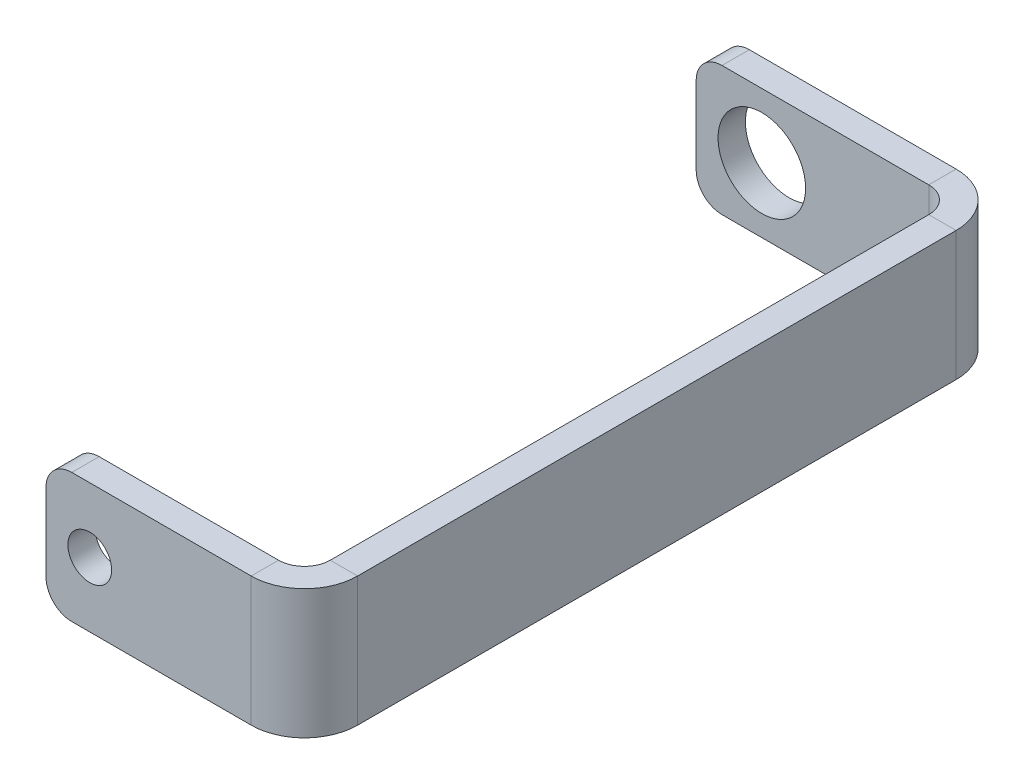
ISO-10303-21;
HEADER;
FILE_DESCRIPTION(('STEP AP214'),'2;1');
FILE_NAME('part.step','',(''),(''),'','','');
FILE_SCHEMA(('AUTOMOTIVE_DESIGN { 1 0 10303 214 1 1 1 1 }'));
ENDSEC;
DATA;
#1=APPLICATION_CONTEXT('core data for automotive mechanical design processes');
#2=APPLICATION_PROTOCOL_DEFINITION('international standard','automotive_design',2000,#1);
#3=PRODUCT_CONTEXT('',#1,'mechanical');
#4=PRODUCT('Part','Part','',(#3));
#5=PRODUCT_RELATED_PRODUCT_CATEGORY('part','',(#4));
#6=PRODUCT_DEFINITION_FORMATION('','',#4);
#7=PRODUCT_DEFINITION_CONTEXT('part definition',#1,'design');
#8=PRODUCT_DEFINITION('design','',#6,#7);
#9=PRODUCT_DEFINITION_SHAPE('','',#8);
#10=(LENGTH_UNIT() NAMED_UNIT(*) SI_UNIT(.MILLI.,.METRE.));
#11=(NAMED_UNIT(*) PLANE_ANGLE_UNIT() SI_UNIT($,.RADIAN.));
#12=(NAMED_UNIT(*) SI_UNIT($,.STERADIAN.) SOLID_ANGLE_UNIT());
#13=UNCERTAINTY_MEASURE_WITH_UNIT(LENGTH_MEASURE(1.E-05),#10,'distance_accuracy_value','');
#14=(GEOMETRIC_REPRESENTATION_CONTEXT(3) GLOBAL_UNCERTAINTY_ASSIGNED_CONTEXT((#13)) GLOBAL_UNIT_ASSIGNED_CONTEXT((#10,
#11,#12)) REPRESENTATION_CONTEXT('',''));
#15=CARTESIAN_POINT('',(0.,0.,0.));
#16=DIRECTION('',(0.,0.,1.));
#17=DIRECTION('',(1.,0.,0.));
#18=AXIS2_PLACEMENT_3D('',#15,#16,#17);
#19=CARTESIAN_POINT('',(18.175,7.5,0.));
#20=DIRECTION('',(0.,1.,0.));
#21=DIRECTION('',(0.,0.,1.));
#22=AXIS2_PLACEMENT_3D('',#19,#20,#21);
#23=PLANE('',#22);
#24=DIRECTION('',(0.,0.,-1.));
#25=VECTOR('',#24,1.);
#26=CARTESIAN_POINT('',(15.,7.5,0.));
#27=LINE('',#26,#25);
#28=CARTESIAN_POINT('',(15.0000000000003,7.5,72.477));
#29=VERTEX_POINT('',#28);
#30=CARTESIAN_POINT('',(15.,7.5,2.99999999999999));
#31=VERTEX_POINT('',#30);
#32=EDGE_CURVE('E236',#29,#31,#27,.T.);
#33=ORIENTED_EDGE('',*,*,#32,.F.);
#34=DIRECTION('',(1.,0.,0.));
#35=VECTOR('',#34,1.);
#36=CARTESIAN_POINT('',(15.0000000000003,7.5,72.477));
#37=LINE('',#36,#35);
#38=CARTESIAN_POINT('',(18.1750000000003,7.5,72.477));
#39=VERTEX_POINT('',#38);
#40=EDGE_CURVE('E208',#29,#39,#37,.T.);
#41=ORIENTED_EDGE('',*,*,#40,.T.);
#42=DIRECTION('',(0.,0.,-1.));
#43=VECTOR('',#42,1.);
#44=CARTESIAN_POINT('',(18.175,7.5,0.));
#45=LINE('',#44,#43);
#46=CARTESIAN_POINT('',(18.175,7.5,2.99999999999998));
#47=VERTEX_POINT('',#46);
#48=EDGE_CURVE('E235',#39,#47,#45,.T.);
#49=ORIENTED_EDGE('',*,*,#48,.T.);
#50=DIRECTION('',(1.,0.,0.));
#51=VECTOR('',#50,1.);
#52=CARTESIAN_POINT('',(15.,7.5,2.99999999999999));
#53=LINE('',#52,#51);
#54=EDGE_CURVE('E223',#31,#47,#53,.T.);
#55=ORIENTED_EDGE('',*,*,#54,.F.);
#56=EDGE_LOOP('',(#33,#41,#49,#55));
#57=FACE_BOUND('',#56,.T.);
#58=ADVANCED_FACE('F43',(#57),#23,.T.);
#59=CARTESIAN_POINT('',(18.175,0.,0.));
#60=DIRECTION('',(1.,0.,0.));
#61=DIRECTION('',(0.,0.,-1.));
#62=AXIS2_PLACEMENT_3D('',#59,#60,#61);
#63=PLANE('',#62);
#64=ORIENTED_EDGE('',*,*,#48,.F.);
#65=DIRECTION('',(0.,1.,0.));
#66=VECTOR('',#65,1.);
#67=CARTESIAN_POINT('',(18.1750000000003,7.5,72.477));
#68=LINE('',#67,#66);
#69=CARTESIAN_POINT('',(18.1750000000003,-7.5,72.477));
#70=VERTEX_POINT('',#69);
#71=EDGE_CURVE('E177',#39,#70,#68,.F.);
#72=ORIENTED_EDGE('',*,*,#71,.T.);
#73=DIRECTION('',(0.,0.,1.));
#74=VECTOR('',#73,1.);
#75=CARTESIAN_POINT('',(18.1750000000003,-7.5,75.477));
#76=LINE('',#75,#74);
#77=CARTESIAN_POINT('',(18.175,-7.5,2.99999999999998));
#78=VERTEX_POINT('',#77);
#79=EDGE_CURVE('E232',#78,#70,#76,.T.);
#80=ORIENTED_EDGE('',*,*,#79,.F.);
#81=DIRECTION('',(0.,1.,0.));
#82=VECTOR('',#81,1.);
#83=CARTESIAN_POINT('',(18.175,0.,2.99999999999998));
#84=LINE('',#83,#82);
#85=EDGE_CURVE('E226',#78,#47,#84,.T.);
#86=ORIENTED_EDGE('',*,*,#85,.T.);
#87=EDGE_LOOP('',(#64,#72,#80,#86));
#88=FACE_BOUND('',#87,.T.);
#89=ADVANCED_FACE('F350',(#88),#63,.T.);
#90=CARTESIAN_POINT('',(15.,0.,0.));
#91=DIRECTION('',(1.,0.,0.));
#92=DIRECTION('',(0.,0.,-1.));
#93=AXIS2_PLACEMENT_3D('',#90,#91,#92);
#94=PLANE('',#93);
#95=DIRECTION('',(0.,1.,0.));
#96=VECTOR('',#95,1.);
#97=CARTESIAN_POINT('',(15.0000000000003,7.5,72.477));
#98=LINE('',#97,#96);
#99=CARTESIAN_POINT('',(15.0000000000003,-7.5,72.477));
#100=VERTEX_POINT('',#99);
#101=EDGE_CURVE('E212',#29,#100,#98,.F.);
#102=ORIENTED_EDGE('',*,*,#101,.F.);
#103=ORIENTED_EDGE('',*,*,#32,.T.);
#104=DIRECTION('',(0.,1.,0.));
#105=VECTOR('',#104,1.);
#106=CARTESIAN_POINT('',(15.,-7.5,2.99999999999999));
#107=LINE('',#106,#105);
#108=CARTESIAN_POINT('',(15.,-7.5,2.99999999999999));
#109=VERTEX_POINT('',#108);
#110=EDGE_CURVE('E220',#109,#31,#107,.T.);
#111=ORIENTED_EDGE('',*,*,#110,.F.);
#112=DIRECTION('',(0.,0.,1.));
#113=VECTOR('',#112,1.);
#114=CARTESIAN_POINT('',(15.0000000000003,-7.5,75.477));
#115=LINE('',#114,#113);
#116=EDGE_CURVE('E231',#109,#100,#115,.T.);
#117=ORIENTED_EDGE('',*,*,#116,.T.);
#118=EDGE_LOOP('',(#102,#103,#111,#117));
#119=FACE_BOUND('',#118,.T.);
#120=ADVANCED_FACE('F360',(#119),#94,.F.);
#121=CARTESIAN_POINT('',(-15.,7.5,-3.175));
#122=DIRECTION('',(0.,1.,0.));
#123=DIRECTION('',(0.,0.,1.));
#124=AXIS2_PLACEMENT_3D('',#121,#122,#123);
#125=PLANE('',#124);
#126=DIRECTION('',(-1.,0.,0.));
#127=VECTOR('',#126,1.);
#128=CARTESIAN_POINT('',(-15.,7.5,-3.175));
#129=LINE('',#128,#127);
#130=CARTESIAN_POINT('',(12.,7.5,-3.175));
#131=VERTEX_POINT('',#130);
#132=CARTESIAN_POINT('',(-12.,7.5,-3.175));
#133=VERTEX_POINT('',#132);
#134=EDGE_CURVE('E266',#131,#133,#129,.T.);
#135=ORIENTED_EDGE('',*,*,#134,.T.);
#136=DIRECTION('',(0.,0.,1.));
#137=VECTOR('',#136,1.);
#138=CARTESIAN_POINT('',(-12.,7.5,-3.175));
#139=LINE('',#138,#137);
#140=CARTESIAN_POINT('',(-12.,7.5,0.));
#141=VERTEX_POINT('',#140);
#142=EDGE_CURVE('E302',#133,#141,#139,.T.);
#143=ORIENTED_EDGE('',*,*,#142,.T.);
#144=DIRECTION('',(-1.,0.,0.));
#145=VECTOR('',#144,1.);
#146=CARTESIAN_POINT('',(-15.,7.5,0.));
#147=LINE('',#146,#145);
#148=CARTESIAN_POINT('',(12.,7.5,0.));
#149=VERTEX_POINT('',#148);
#150=EDGE_CURVE('E263',#149,#141,#147,.T.);
#151=ORIENTED_EDGE('',*,*,#150,.F.);
#152=DIRECTION('',(0.,0.,-1.));
#153=VECTOR('',#152,1.);
#154=CARTESIAN_POINT('',(12.,7.5,0.));
#155=LINE('',#154,#153);
#156=EDGE_CURVE('E249',#149,#131,#155,.T.);
#157=ORIENTED_EDGE('',*,*,#156,.T.);
#158=EDGE_LOOP('',(#135,#143,#151,#157));
#159=FACE_BOUND('',#158,.T.);
#160=ADVANCED_FACE('F321',(#159),#125,.T.);
#161=CARTESIAN_POINT('',(0.,0.,-3.175));
#162=DIRECTION('',(0.,0.,-1.));
#163=DIRECTION('',(-1.,0.,0.));
#164=AXIS2_PLACEMENT_3D('',#161,#162,#163);
#165=PLANE('',#164);
#166=CARTESIAN_POINT('',(-7.38,0.,-3.175));
#167=DIRECTION('',(0.,0.,1.));
#168=DIRECTION('',(1.,0.,0.));
#169=AXIS2_PLACEMENT_3D('',#166,#167,#168);
#170=CIRCLE('',#169,5.08);
#171=CARTESIAN_POINT('',(-2.3,0.,-3.175));
#172=VERTEX_POINT('',#171);
#173=EDGE_CURVE('E370',#172,#172,#170,.T.);
#174=ORIENTED_EDGE('',*,*,#173,.T.);
#175=EDGE_LOOP('',(#174));
#176=FACE_BOUND('',#175,.T.);
#177=DIRECTION('',(0.,-1.,0.));
#178=VECTOR('',#177,1.);
#179=CARTESIAN_POINT('',(-15.,-7.5,-3.175));
#180=LINE('',#179,#178);
#181=CARTESIAN_POINT('',(-15.,4.5,-3.175));
#182=VERTEX_POINT('',#181);
#183=CARTESIAN_POINT('',(-15.,-4.5,-3.175));
#184=VERTEX_POINT('',#183);
#185=EDGE_CURVE('E269',#182,#184,#180,.T.);
#186=ORIENTED_EDGE('',*,*,#185,.F.);
#187=CARTESIAN_POINT('',(-12.,4.5,-3.175));
#188=DIRECTION('',(0.,0.,-1.));
#189=DIRECTION('',(-1.,0.,0.));
#190=AXIS2_PLACEMENT_3D('',#187,#188,#189);
#191=CIRCLE('',#190,3.);
#192=EDGE_CURVE('E51',#182,#133,#191,.T.);
#193=ORIENTED_EDGE('',*,*,#192,.T.);
#194=ORIENTED_EDGE('',*,*,#134,.F.);
#195=DIRECTION('',(0.,1.,0.));
#196=VECTOR('',#195,1.);
#197=CARTESIAN_POINT('',(12.,7.5,-3.175));
#198=LINE('',#197,#196);
#199=CARTESIAN_POINT('',(12.,-7.5,-3.175));
#200=VERTEX_POINT('',#199);
#201=EDGE_CURVE('E242',#131,#200,#198,.F.);
#202=ORIENTED_EDGE('',*,*,#201,.T.);
#203=DIRECTION('',(1.,0.,0.));
#204=VECTOR('',#203,1.);
#205=CARTESIAN_POINT('',(-15.,-7.5,-3.175));
#206=LINE('',#205,#204);
#207=CARTESIAN_POINT('',(-12.,-7.5,-3.175));
#208=VERTEX_POINT('',#207);
#209=EDGE_CURVE('E272',#208,#200,#206,.T.);
#210=ORIENTED_EDGE('',*,*,#209,.F.);
#211=CARTESIAN_POINT('',(-12.,-4.5,-3.175));
#212=DIRECTION('',(0.,0.,-1.));
#213=DIRECTION('',(-1.,0.,0.));
#214=AXIS2_PLACEMENT_3D('',#211,#212,#213);
#215=CIRCLE('',#214,3.);
#216=EDGE_CURVE('E63',#208,#184,#215,.T.);
#217=ORIENTED_EDGE('',*,*,#216,.T.);
#218=EDGE_LOOP('',(#186,#193,#194,#202,#210,#217));
#219=FACE_BOUND('',#218,.T.);
#220=ADVANCED_FACE('F316',(#176,#219),#165,.T.);
#221=CARTESIAN_POINT('',(0.,0.,0.));
#222=DIRECTION('',(0.,0.,-1.));
#223=DIRECTION('',(-1.,0.,0.));
#224=AXIS2_PLACEMENT_3D('',#221,#222,#223);
#225=PLANE('',#224);
#226=CARTESIAN_POINT('',(-7.38,0.,0.));
#227=DIRECTION('',(0.,0.,1.));
#228=DIRECTION('',(1.,0.,0.));
#229=AXIS2_PLACEMENT_3D('',#226,#227,#228);
#230=CIRCLE('',#229,5.08);
#231=CARTESIAN_POINT('',(-2.3,0.,0.));
#232=VERTEX_POINT('',#231);
#233=EDGE_CURVE('E284',#232,#232,#230,.T.);
#234=ORIENTED_EDGE('',*,*,#233,.F.);
#235=EDGE_LOOP('',(#234));
#236=FACE_BOUND('',#235,.T.);
#237=ORIENTED_EDGE('',*,*,#150,.T.);
#238=CARTESIAN_POINT('',(-12.,4.5,0.));
#239=DIRECTION('',(0.,0.,-1.));
#240=DIRECTION('',(-1.,0.,0.));
#241=AXIS2_PLACEMENT_3D('',#238,#239,#240);
#242=CIRCLE('',#241,3.);
#243=CARTESIAN_POINT('',(-15.,4.5,0.));
#244=VERTEX_POINT('',#243);
#245=EDGE_CURVE('E307',#141,#244,#242,.F.);
#246=ORIENTED_EDGE('',*,*,#245,.T.);
#247=DIRECTION('',(0.,-1.,0.));
#248=VECTOR('',#247,1.);
#249=CARTESIAN_POINT('',(-15.,-7.5,0.));
#250=LINE('',#249,#248);
#251=CARTESIAN_POINT('',(-15.,-4.5,0.));
#252=VERTEX_POINT('',#251);
#253=EDGE_CURVE('E277',#244,#252,#250,.T.);
#254=ORIENTED_EDGE('',*,*,#253,.T.);
#255=CARTESIAN_POINT('',(-12.,-4.5,0.));
#256=DIRECTION('',(0.,0.,-1.));
#257=DIRECTION('',(-1.,0.,0.));
#258=AXIS2_PLACEMENT_3D('',#255,#256,#257);
#259=CIRCLE('',#258,3.);
#260=CARTESIAN_POINT('',(-12.,-7.5,0.));
#261=VERTEX_POINT('',#260);
#262=EDGE_CURVE('E305',#252,#261,#259,.F.);
#263=ORIENTED_EDGE('',*,*,#262,.T.);
#264=DIRECTION('',(1.,0.,0.));
#265=VECTOR('',#264,1.);
#266=CARTESIAN_POINT('',(-15.,-7.5,0.));
#267=LINE('',#266,#265);
#268=CARTESIAN_POINT('',(12.,-7.5,0.));
#269=VERTEX_POINT('',#268);
#270=EDGE_CURVE('E270',#261,#269,#267,.T.);
#271=ORIENTED_EDGE('',*,*,#270,.T.);
#272=DIRECTION('',(0.,1.,0.));
#273=VECTOR('',#272,1.);
#274=CARTESIAN_POINT('',(12.,7.5,0.));
#275=LINE('',#274,#273);
#276=EDGE_CURVE('E255',#149,#269,#275,.F.);
#277=ORIENTED_EDGE('',*,*,#276,.F.);
#278=EDGE_LOOP('',(#237,#246,#254,#263,#271,#277));
#279=FACE_BOUND('',#278,.T.);
#280=ADVANCED_FACE('F326',(#236,#279),#225,.F.);
#281=CARTESIAN_POINT('',(-15.,-7.5,-3.175));
#282=DIRECTION('',(0.,-1.,0.));
#283=DIRECTION('',(0.,0.,-1.));
#284=AXIS2_PLACEMENT_3D('',#281,#282,#283);
#285=PLANE('',#284);
#286=ORIENTED_EDGE('',*,*,#270,.F.);
#287=DIRECTION('',(0.,0.,1.));
#288=VECTOR('',#287,1.);
#289=CARTESIAN_POINT('',(-12.,-7.5,-3.175));
#290=LINE('',#289,#288);
#291=EDGE_CURVE('E11',#261,#208,#290,.F.);
#292=ORIENTED_EDGE('',*,*,#291,.T.);
#293=ORIENTED_EDGE('',*,*,#209,.T.);
#294=DIRECTION('',(0.,0.,-1.));
#295=VECTOR('',#294,1.);
#296=CARTESIAN_POINT('',(12.,-7.5,0.));
#297=LINE('',#296,#295);
#298=EDGE_CURVE('E260',#269,#200,#297,.T.);
#299=ORIENTED_EDGE('',*,*,#298,.F.);
#300=EDGE_LOOP('',(#286,#292,#293,#299));
#301=FACE_BOUND('',#300,.T.);
#302=ADVANCED_FACE('F333',(#301),#285,.T.);
#303=CARTESIAN_POINT('',(-15.,-7.5,-3.175));
#304=DIRECTION('',(-1.,0.,0.));
#305=DIRECTION('',(0.,0.,1.));
#306=AXIS2_PLACEMENT_3D('',#303,#304,#305);
#307=PLANE('',#306);
#308=ORIENTED_EDGE('',*,*,#253,.F.);
#309=DIRECTION('',(0.,0.,1.));
#310=VECTOR('',#309,1.);
#311=CARTESIAN_POINT('',(-15.,4.5,-3.175));
#312=LINE('',#311,#310);
#313=EDGE_CURVE('E312',#244,#182,#312,.F.);
#314=ORIENTED_EDGE('',*,*,#313,.T.);
#315=ORIENTED_EDGE('',*,*,#185,.T.);
#316=DIRECTION('',(0.,0.,1.));
#317=VECTOR('',#316,1.);
#318=CARTESIAN_POINT('',(-15.,-4.5,-3.175));
#319=LINE('',#318,#317);
#320=EDGE_CURVE('E309',#184,#252,#319,.T.);
#321=ORIENTED_EDGE('',*,*,#320,.T.);
#322=EDGE_LOOP('',(#308,#314,#315,#321));
#323=FACE_BOUND('',#322,.T.);
#324=ADVANCED_FACE('F329',(#323),#307,.T.);
#325=CARTESIAN_POINT('',(12.,-7.5,3.));
#326=DIRECTION('',(0.,-1.,0.));
#327=DIRECTION('',(0.,0.,-1.));
#328=AXIS2_PLACEMENT_3D('',#325,#326,#327);
#329=PLANE('',#328);
#330=DIRECTION('',(1.,0.,0.));
#331=VECTOR('',#330,1.);
#332=CARTESIAN_POINT('',(15.,-7.5,2.99999999999999));
#333=LINE('',#332,#331);
#334=EDGE_CURVE('E218',#109,#78,#333,.T.);
#335=ORIENTED_EDGE('',*,*,#334,.F.);
#336=CARTESIAN_POINT('',(12.,-7.5,3.));
#337=DIRECTION('',(0.,1.,0.));
#338=DIRECTION('',(0.,0.,1.));
#339=AXIS2_PLACEMENT_3D('',#336,#337,#338);
#340=CIRCLE('',#339,3.);
#341=EDGE_CURVE('E252',#269,#109,#340,.F.);
#342=ORIENTED_EDGE('',*,*,#341,.F.);
#343=ORIENTED_EDGE('',*,*,#298,.T.);
#344=CARTESIAN_POINT('',(12.,-7.5,3.));
#345=DIRECTION('',(0.,1.,0.));
#346=DIRECTION('',(0.,0.,1.));
#347=AXIS2_PLACEMENT_3D('',#344,#345,#346);
#348=CIRCLE('',#347,6.175);
#349=EDGE_CURVE('E245',#200,#78,#348,.F.);
#350=ORIENTED_EDGE('',*,*,#349,.T.);
#351=EDGE_LOOP('',(#335,#342,#343,#350));
#352=FACE_BOUND('',#351,.T.);
#353=ADVANCED_FACE('F337',(#352),#329,.T.);
#354=CARTESIAN_POINT('',(12.,7.5,3.));
#355=DIRECTION('',(0.,-1.,0.));
#356=DIRECTION('',(0.,0.,-1.));
#357=AXIS2_PLACEMENT_3D('',#354,#355,#356);
#358=PLANE('',#357);
#359=CARTESIAN_POINT('',(12.,7.5,3.));
#360=DIRECTION('',(0.,1.,0.));
#361=DIRECTION('',(0.,0.,1.));
#362=AXIS2_PLACEMENT_3D('',#359,#360,#361);
#363=CIRCLE('',#362,3.);
#364=EDGE_CURVE('E238',#31,#149,#363,.T.);
#365=ORIENTED_EDGE('',*,*,#364,.F.);
#366=ORIENTED_EDGE('',*,*,#54,.T.);
#367=CARTESIAN_POINT('',(12.,7.5,3.));
#368=DIRECTION('',(0.,1.,0.));
#369=DIRECTION('',(0.,0.,1.));
#370=AXIS2_PLACEMENT_3D('',#367,#368,#369);
#371=CIRCLE('',#370,6.175);
#372=EDGE_CURVE('E246',#47,#131,#371,.T.);
#373=ORIENTED_EDGE('',*,*,#372,.T.);
#374=ORIENTED_EDGE('',*,*,#156,.F.);
#375=EDGE_LOOP('',(#365,#366,#373,#374));
#376=FACE_BOUND('',#375,.T.);
#377=ADVANCED_FACE('F343',(#376),#358,.F.);
#378=CARTESIAN_POINT('',(12.,7.5,3.));
#379=DIRECTION('',(0.,1.,0.));
#380=DIRECTION('',(1.,0.,0.));
#381=AXIS2_PLACEMENT_3D('',#378,#379,#380);
#382=CYLINDRICAL_SURFACE('',#381,6.175);
#383=ORIENTED_EDGE('',*,*,#201,.F.);
#384=ORIENTED_EDGE('',*,*,#372,.F.);
#385=ORIENTED_EDGE('',*,*,#85,.F.);
#386=ORIENTED_EDGE('',*,*,#349,.F.);
#387=EDGE_LOOP('',(#383,#384,#385,#386));
#388=FACE_BOUND('',#387,.T.);
#389=ADVANCED_FACE('F340',(#388),#382,.T.);
#390=CARTESIAN_POINT('',(12.,7.5,3.));
#391=DIRECTION('',(0.,1.,0.));
#392=DIRECTION('',(1.,0.,0.));
#393=AXIS2_PLACEMENT_3D('',#390,#391,#392);
#394=CYLINDRICAL_SURFACE('',#393,3.);
#395=ORIENTED_EDGE('',*,*,#276,.T.);
#396=ORIENTED_EDGE('',*,*,#341,.T.);
#397=ORIENTED_EDGE('',*,*,#110,.T.);
#398=ORIENTED_EDGE('',*,*,#364,.T.);
#399=EDGE_LOOP('',(#395,#396,#397,#398));
#400=FACE_BOUND('',#399,.T.);
#401=ADVANCED_FACE('F357',(#400),#394,.F.);
#402=CARTESIAN_POINT('',(18.1750000000003,-7.5,75.477));
#403=DIRECTION('',(0.,-1.,0.));
#404=DIRECTION('',(0.,0.,-1.));
#405=AXIS2_PLACEMENT_3D('',#402,#403,#404);
#406=PLANE('',#405);
#407=DIRECTION('',(1.,0.,0.));
#408=VECTOR('',#407,1.);
#409=CARTESIAN_POINT('',(15.0000000000003,-7.5,72.477));
#410=LINE('',#409,#408);
#411=EDGE_CURVE('E215',#100,#70,#410,.T.);
#412=ORIENTED_EDGE('',*,*,#411,.F.);
#413=ORIENTED_EDGE('',*,*,#116,.F.);
#414=ORIENTED_EDGE('',*,*,#334,.T.);
#415=ORIENTED_EDGE('',*,*,#79,.T.);
#416=EDGE_LOOP('',(#412,#413,#414,#415));
#417=FACE_BOUND('',#416,.T.);
#418=ADVANCED_FACE('F353',(#417),#406,.T.);
#419=CARTESIAN_POINT('',(12.0000000000003,-7.5,72.477));
#420=DIRECTION('',(0.,-1.,0.));
#421=DIRECTION('',(0.,0.,-1.));
#422=AXIS2_PLACEMENT_3D('',#419,#420,#421);
#423=PLANE('',#422);
#424=DIRECTION('',(0.,0.,1.));
#425=VECTOR('',#424,1.);
#426=CARTESIAN_POINT('',(12.0000000000003,-7.5,75.477));
#427=LINE('',#426,#425);
#428=CARTESIAN_POINT('',(12.0000000000003,-7.5,75.477));
#429=VERTEX_POINT('',#428);
#430=CARTESIAN_POINT('',(12.0000000000003,-7.49999999999999,78.652));
#431=VERTEX_POINT('',#430);
#432=EDGE_CURVE('E198',#429,#431,#427,.T.);
#433=ORIENTED_EDGE('',*,*,#432,.F.);
#434=CARTESIAN_POINT('',(12.0000000000003,-7.5,72.477));
#435=DIRECTION('',(0.,1.,0.));
#436=DIRECTION('',(0.,0.,1.));
#437=AXIS2_PLACEMENT_3D('',#434,#435,#436);
#438=CIRCLE('',#437,3.);
#439=EDGE_CURVE('E180',#100,#429,#438,.F.);
#440=ORIENTED_EDGE('',*,*,#439,.F.);
#441=ORIENTED_EDGE('',*,*,#411,.T.);
#442=CARTESIAN_POINT('',(12.0000000000003,-7.49999999999999,72.477));
#443=DIRECTION('',(0.,1.,0.));
#444=DIRECTION('',(0.,0.,1.));
#445=AXIS2_PLACEMENT_3D('',#442,#443,#444);
#446=CIRCLE('',#445,6.175);
#447=EDGE_CURVE('E207',#70,#431,#446,.F.);
#448=ORIENTED_EDGE('',*,*,#447,.T.);
#449=EDGE_LOOP('',(#433,#440,#441,#448));
#450=FACE_BOUND('',#449,.T.);
#451=ADVANCED_FACE('F406',(#450),#423,.T.);
#452=CARTESIAN_POINT('',(12.0000000000003,7.5,72.477));
#453=DIRECTION('',(0.,-1.,0.));
#454=DIRECTION('',(0.,0.,-1.));
#455=AXIS2_PLACEMENT_3D('',#452,#453,#454);
#456=PLANE('',#455);
#457=CARTESIAN_POINT('',(12.0000000000003,7.5,72.477));
#458=DIRECTION('',(0.,1.,0.));
#459=DIRECTION('',(0.,0.,1.));
#460=AXIS2_PLACEMENT_3D('',#457,#458,#459);
#461=CIRCLE('',#460,3.);
#462=CARTESIAN_POINT('',(12.0000000000003,7.5,75.477));
#463=VERTEX_POINT('',#462);
#464=EDGE_CURVE('E167',#463,#29,#461,.T.);
#465=ORIENTED_EDGE('',*,*,#464,.F.);
#466=DIRECTION('',(0.,0.,1.));
#467=VECTOR('',#466,1.);
#468=CARTESIAN_POINT('',(12.0000000000003,7.5,75.477));
#469=LINE('',#468,#467);
#470=CARTESIAN_POINT('',(12.0000000000003,7.5,78.652));
#471=VERTEX_POINT('',#470);
#472=EDGE_CURVE('E161',#463,#471,#469,.T.);
#473=ORIENTED_EDGE('',*,*,#472,.T.);
#474=CARTESIAN_POINT('',(12.0000000000003,7.5,72.477));
#475=DIRECTION('',(0.,1.,0.));
#476=DIRECTION('',(0.,0.,1.));
#477=AXIS2_PLACEMENT_3D('',#474,#475,#476);
#478=CIRCLE('',#477,6.175);
#479=EDGE_CURVE('E172',#471,#39,#478,.T.);
#480=ORIENTED_EDGE('',*,*,#479,.T.);
#481=ORIENTED_EDGE('',*,*,#40,.F.);
#482=EDGE_LOOP('',(#465,#473,#480,#481));
#483=FACE_BOUND('',#482,.T.);
#484=ADVANCED_FACE('F183',(#483),#456,.F.);
#485=CARTESIAN_POINT('',(12.0000000000003,7.5,72.477));
#486=DIRECTION('',(0.,1.,0.));
#487=DIRECTION('',(0.,0.,1.));
#488=AXIS2_PLACEMENT_3D('',#485,#486,#487);
#489=CYLINDRICAL_SURFACE('',#488,6.175);
#490=ORIENTED_EDGE('',*,*,#71,.F.);
#491=ORIENTED_EDGE('',*,*,#479,.F.);
#492=DIRECTION('',(0.,1.,0.));
#493=VECTOR('',#492,1.);
#494=CARTESIAN_POINT('',(12.0000000000003,0.,78.652));
#495=LINE('',#494,#493);
#496=EDGE_CURVE('E174',#431,#471,#495,.T.);
#497=ORIENTED_EDGE('',*,*,#496,.F.);
#498=ORIENTED_EDGE('',*,*,#447,.F.);
#499=EDGE_LOOP('',(#490,#491,#497,#498));
#500=FACE_BOUND('',#499,.T.);
#501=ADVANCED_FACE('F173',(#500),#489,.T.);
#502=CARTESIAN_POINT('',(12.0000000000003,7.5,72.477));
#503=DIRECTION('',(0.,1.,0.));
#504=DIRECTION('',(0.,0.,1.));
#505=AXIS2_PLACEMENT_3D('',#502,#503,#504);
#506=CYLINDRICAL_SURFACE('',#505,3.);
#507=ORIENTED_EDGE('',*,*,#101,.T.);
#508=ORIENTED_EDGE('',*,*,#439,.T.);
#509=DIRECTION('',(0.,1.,0.));
#510=VECTOR('',#509,1.);
#511=CARTESIAN_POINT('',(12.0000000000003,-7.5,75.477));
#512=LINE('',#511,#510);
#513=EDGE_CURVE('E185',#429,#463,#512,.T.);
#514=ORIENTED_EDGE('',*,*,#513,.T.);
#515=ORIENTED_EDGE('',*,*,#464,.T.);
#516=EDGE_LOOP('',(#507,#508,#514,#515));
#517=FACE_BOUND('',#516,.T.);
#518=ADVANCED_FACE('F363',(#517),#506,.F.);
#519=CARTESIAN_POINT('',(15.0000000000003,7.5,78.652));
#520=DIRECTION('',(0.,1.,0.));
#521=DIRECTION('',(0.,0.,1.));
#522=AXIS2_PLACEMENT_3D('',#519,#520,#521);
#523=PLANE('',#522);
#524=DIRECTION('',(1.,0.,0.));
#525=VECTOR('',#524,1.);
#526=CARTESIAN_POINT('',(15.0000000000003,7.5,75.477));
#527=LINE('',#526,#525);
#528=CARTESIAN_POINT('',(-8.82499999999974,7.5,75.4770000000002));
#529=VERTEX_POINT('',#528);
#530=EDGE_CURVE('E200',#529,#463,#527,.T.);
#531=ORIENTED_EDGE('',*,*,#530,.F.);
#532=DIRECTION('',(0.,0.,-1.));
#533=VECTOR('',#532,1.);
#534=CARTESIAN_POINT('',(-8.82499999999972,7.5,78.6520000000002));
#535=LINE('',#534,#533);
#536=CARTESIAN_POINT('',(-8.82499999999971,7.5,78.6520000000002));
#537=VERTEX_POINT('',#536);
#538=EDGE_CURVE('E163',#529,#537,#535,.F.);
#539=ORIENTED_EDGE('',*,*,#538,.T.);
#540=DIRECTION('',(1.,0.,0.));
#541=VECTOR('',#540,1.);
#542=CARTESIAN_POINT('',(15.0000000000003,7.5,78.652));
#543=LINE('',#542,#541);
#544=EDGE_CURVE('E156',#537,#471,#543,.T.);
#545=ORIENTED_EDGE('',*,*,#544,.T.);
#546=ORIENTED_EDGE('',*,*,#472,.F.);
#547=EDGE_LOOP('',(#531,#539,#545,#546));
#548=FACE_BOUND('',#547,.T.);
#549=ADVANCED_FACE('F159',(#548),#523,.T.);
#550=CARTESIAN_POINT('',(-11.8249999999997,-7.5,78.6520000000002));
#551=DIRECTION('',(0.,-1.,0.));
#552=DIRECTION('',(0.,0.,-1.));
#553=AXIS2_PLACEMENT_3D('',#550,#551,#552);
#554=PLANE('',#553);
#555=DIRECTION('',(-1.,0.,0.));
#556=VECTOR('',#555,1.);
#557=CARTESIAN_POINT('',(-11.8249999999997,-7.5,78.6520000000002));
#558=LINE('',#557,#556);
#559=CARTESIAN_POINT('',(-8.82499999999972,-7.5,78.6520000000002));
#560=VERTEX_POINT('',#559);
#561=EDGE_CURVE('E190',#431,#560,#558,.T.);
#562=ORIENTED_EDGE('',*,*,#561,.T.);
#563=DIRECTION('',(0.,0.,-1.));
#564=VECTOR('',#563,1.);
#565=CARTESIAN_POINT('',(-8.82499999999972,-7.5,78.6520000000002));
#566=LINE('',#565,#564);
#567=CARTESIAN_POINT('',(-8.82499999999975,-7.5,75.4770000000002));
#568=VERTEX_POINT('',#567);
#569=EDGE_CURVE('E299',#560,#568,#566,.T.);
#570=ORIENTED_EDGE('',*,*,#569,.T.);
#571=DIRECTION('',(-1.,0.,0.));
#572=VECTOR('',#571,1.);
#573=CARTESIAN_POINT('',(-11.8249999999997,-7.5,75.4770000000002));
#574=LINE('',#573,#572);
#575=EDGE_CURVE('E191',#429,#568,#574,.T.);
#576=ORIENTED_EDGE('',*,*,#575,.F.);
#577=ORIENTED_EDGE('',*,*,#432,.T.);
#578=EDGE_LOOP('',(#562,#570,#576,#577));
#579=FACE_BOUND('',#578,.T.);
#580=ADVANCED_FACE('F384',(#579),#554,.T.);
#581=CARTESIAN_POINT('',(5.68844678824843E-13,0.,78.6520000000001));
#582=DIRECTION('',(0.,0.,1.));
#583=DIRECTION('',(1.,0.,0.));
#584=AXIS2_PLACEMENT_3D('',#581,#582,#583);
#585=PLANE('',#584);
#586=CARTESIAN_POINT('',(-6.74499999999972,0.,78.6520000000001));
#587=DIRECTION('',(0.,0.,1.));
#588=DIRECTION('',(1.,0.,0.));
#589=AXIS2_PLACEMENT_3D('',#586,#587,#588);
#590=CIRCLE('',#589,2.54);
#591=CARTESIAN_POINT('',(-4.20499999999972,0.,78.6520000000001));
#592=VERTEX_POINT('',#591);
#593=EDGE_CURVE('E285',#592,#592,#590,.T.);
#594=ORIENTED_EDGE('',*,*,#593,.F.);
#595=EDGE_LOOP('',(#594));
#596=FACE_BOUND('',#595,.T.);
#597=ORIENTED_EDGE('',*,*,#544,.F.);
#598=CARTESIAN_POINT('',(-8.82499999999972,4.5,78.6520000000002));
#599=DIRECTION('',(0.,0.,1.));
#600=DIRECTION('',(1.,0.,0.));
#601=AXIS2_PLACEMENT_3D('',#598,#599,#600);
#602=CIRCLE('',#601,3.);
#603=CARTESIAN_POINT('',(-11.8249999999997,4.5,78.6520000000002));
#604=VERTEX_POINT('',#603);
#605=EDGE_CURVE('E297',#537,#604,#602,.T.);
#606=ORIENTED_EDGE('',*,*,#605,.T.);
#607=DIRECTION('',(0.,1.,0.));
#608=VECTOR('',#607,1.);
#609=CARTESIAN_POINT('',(-11.8249999999997,7.5,78.6520000000002));
#610=LINE('',#609,#608);
#611=CARTESIAN_POINT('',(-11.8249999999997,-4.5,78.6520000000002));
#612=VERTEX_POINT('',#611);
#613=EDGE_CURVE('E168',#612,#604,#610,.T.);
#614=ORIENTED_EDGE('',*,*,#613,.F.);
#615=CARTESIAN_POINT('',(-8.82499999999972,-4.5,78.6520000000002));
#616=DIRECTION('',(0.,0.,1.));
#617=DIRECTION('',(1.,0.,0.));
#618=AXIS2_PLACEMENT_3D('',#615,#616,#617);
#619=CIRCLE('',#618,3.);
#620=EDGE_CURVE('E295',#612,#560,#619,.T.);
#621=ORIENTED_EDGE('',*,*,#620,.T.);
#622=ORIENTED_EDGE('',*,*,#561,.F.);
#623=ORIENTED_EDGE('',*,*,#496,.T.);
#624=EDGE_LOOP('',(#597,#606,#614,#621,#622,#623));
#625=FACE_BOUND('',#624,.T.);
#626=ADVANCED_FACE('F188',(#596,#625),#585,.T.);
#627=CARTESIAN_POINT('',(5.46667402243645E-13,0.,75.4770000000001));
#628=DIRECTION('',(0.,0.,1.));
#629=DIRECTION('',(1.,0.,0.));
#630=AXIS2_PLACEMENT_3D('',#627,#628,#629);
#631=PLANE('',#630);
#632=CARTESIAN_POINT('',(-6.74499999999972,0.,75.4770000000002));
#633=DIRECTION('',(0.,0.,1.));
#634=DIRECTION('',(1.,0.,0.));
#635=AXIS2_PLACEMENT_3D('',#632,#633,#634);
#636=CIRCLE('',#635,2.54);
#637=CARTESIAN_POINT('',(-4.20499999999972,0.,75.4770000000002));
#638=VERTEX_POINT('',#637);
#639=EDGE_CURVE('E281',#638,#638,#636,.T.);
#640=ORIENTED_EDGE('',*,*,#639,.T.);
#641=EDGE_LOOP('',(#640));
#642=FACE_BOUND('',#641,.T.);
#643=DIRECTION('',(0.,1.,0.));
#644=VECTOR('',#643,1.);
#645=CARTESIAN_POINT('',(-11.8249999999997,7.5,75.4770000000002));
#646=LINE('',#645,#644);
#647=CARTESIAN_POINT('',(-11.8249999999997,-4.5,75.4770000000002));
#648=VERTEX_POINT('',#647);
#649=CARTESIAN_POINT('',(-11.8249999999997,4.5,75.4770000000002));
#650=VERTEX_POINT('',#649);
#651=EDGE_CURVE('E194',#648,#650,#646,.T.);
#652=ORIENTED_EDGE('',*,*,#651,.T.);
#653=CARTESIAN_POINT('',(-8.82499999999975,4.5,75.4770000000002));
#654=DIRECTION('',(0.,0.,1.));
#655=DIRECTION('',(1.,0.,0.));
#656=AXIS2_PLACEMENT_3D('',#653,#654,#655);
#657=CIRCLE('',#656,3.);
#658=EDGE_CURVE('E292',#650,#529,#657,.F.);
#659=ORIENTED_EDGE('',*,*,#658,.T.);
#660=ORIENTED_EDGE('',*,*,#530,.T.);
#661=ORIENTED_EDGE('',*,*,#513,.F.);
#662=ORIENTED_EDGE('',*,*,#575,.T.);
#663=CARTESIAN_POINT('',(-8.82499999999975,-4.5,75.4770000000002));
#664=DIRECTION('',(0.,0.,1.));
#665=DIRECTION('',(1.,0.,0.));
#666=AXIS2_PLACEMENT_3D('',#663,#664,#665);
#667=CIRCLE('',#666,3.);
#668=EDGE_CURVE('E290',#568,#648,#667,.F.);
#669=ORIENTED_EDGE('',*,*,#668,.T.);
#670=EDGE_LOOP('',(#652,#659,#660,#661,#662,#669));
#671=FACE_BOUND('',#670,.T.);
#672=ADVANCED_FACE('F383',(#642,#671),#631,.F.);
#673=CARTESIAN_POINT('',(-11.8249999999997,7.5,78.6520000000002));
#674=DIRECTION('',(-1.,0.,0.));
#675=DIRECTION('',(0.,0.,1.));
#676=AXIS2_PLACEMENT_3D('',#673,#674,#675);
#677=PLANE('',#676);
#678=ORIENTED_EDGE('',*,*,#613,.T.);
#679=DIRECTION('',(0.,0.,-1.));
#680=VECTOR('',#679,1.);
#681=CARTESIAN_POINT('',(-11.8249999999997,4.5,78.6520000000002));
#682=LINE('',#681,#680);
#683=EDGE_CURVE('E287',#604,#650,#682,.T.);
#684=ORIENTED_EDGE('',*,*,#683,.T.);
#685=ORIENTED_EDGE('',*,*,#651,.F.);
#686=DIRECTION('',(0.,0.,-1.));
#687=VECTOR('',#686,1.);
#688=CARTESIAN_POINT('',(-11.8249999999997,-4.5,78.6520000000002));
#689=LINE('',#688,#687);
#690=EDGE_CURVE('E274',#648,#612,#689,.F.);
#691=ORIENTED_EDGE('',*,*,#690,.T.);
#692=EDGE_LOOP('',(#678,#684,#685,#691));
#693=FACE_BOUND('',#692,.T.);
#694=ADVANCED_FACE('F390',(#693),#677,.T.);
#695=CARTESIAN_POINT('',(-7.38,0.,-3.175));
#696=DIRECTION('',(0.,0.,1.));
#697=DIRECTION('',(1.,0.,0.));
#698=AXIS2_PLACEMENT_3D('',#695,#696,#697);
#699=CYLINDRICAL_SURFACE('',#698,5.08);
#700=ORIENTED_EDGE('',*,*,#173,.F.);
#701=EDGE_LOOP('',(#700));
#702=FACE_BOUND('',#701,.T.);
#703=ORIENTED_EDGE('',*,*,#233,.T.);
#704=EDGE_LOOP('',(#703));
#705=FACE_BOUND('',#704,.T.);
#706=ADVANCED_FACE('F471',(#702,#705),#699,.F.);
#707=CARTESIAN_POINT('',(-6.74499999999972,0.,68.6520000000001));
#708=DIRECTION('',(0.,0.,1.));
#709=DIRECTION('',(1.,0.,0.));
#710=AXIS2_PLACEMENT_3D('',#707,#708,#709);
#711=CYLINDRICAL_SURFACE('',#710,2.54);
#712=ORIENTED_EDGE('',*,*,#593,.T.);
#713=EDGE_LOOP('',(#712));
#714=FACE_BOUND('',#713,.T.);
#715=ORIENTED_EDGE('',*,*,#639,.F.);
#716=EDGE_LOOP('',(#715));
#717=FACE_BOUND('',#716,.T.);
#718=ADVANCED_FACE('F379',(#714,#717),#711,.F.);
#719=CARTESIAN_POINT('',(-8.82499999999972,4.5,78.6520000000002));
#720=DIRECTION('',(0.,0.,-1.));
#721=DIRECTION('',(-1.,0.,0.));
#722=AXIS2_PLACEMENT_3D('',#719,#720,#721);
#723=CYLINDRICAL_SURFACE('',#722,3.);
#724=ORIENTED_EDGE('',*,*,#605,.F.);
#725=ORIENTED_EDGE('',*,*,#538,.F.);
#726=ORIENTED_EDGE('',*,*,#658,.F.);
#727=ORIENTED_EDGE('',*,*,#683,.F.);
#728=EDGE_LOOP('',(#724,#725,#726,#727));
#729=FACE_BOUND('',#728,.T.);
#730=ADVANCED_FACE('F427',(#729),#723,.T.);
#731=CARTESIAN_POINT('',(-8.82499999999972,-4.5,78.6520000000002));
#732=DIRECTION('',(0.,0.,-1.));
#733=DIRECTION('',(-1.,0.,0.));
#734=AXIS2_PLACEMENT_3D('',#731,#732,#733);
#735=CYLINDRICAL_SURFACE('',#734,3.);
#736=ORIENTED_EDGE('',*,*,#620,.F.);
#737=ORIENTED_EDGE('',*,*,#690,.F.);
#738=ORIENTED_EDGE('',*,*,#668,.F.);
#739=ORIENTED_EDGE('',*,*,#569,.F.);
#740=EDGE_LOOP('',(#736,#737,#738,#739));
#741=FACE_BOUND('',#740,.T.);
#742=ADVANCED_FACE('F430',(#741),#735,.T.);
#743=CARTESIAN_POINT('',(-12.,4.5,-3.175));
#744=DIRECTION('',(0.,0.,1.));
#745=DIRECTION('',(1.,0.,0.));
#746=AXIS2_PLACEMENT_3D('',#743,#744,#745);
#747=CYLINDRICAL_SURFACE('',#746,3.);
#748=ORIENTED_EDGE('',*,*,#192,.F.);
#749=ORIENTED_EDGE('',*,*,#313,.F.);
#750=ORIENTED_EDGE('',*,*,#245,.F.);
#751=ORIENTED_EDGE('',*,*,#142,.F.);
#752=EDGE_LOOP('',(#748,#749,#750,#751));
#753=FACE_BOUND('',#752,.T.);
#754=ADVANCED_FACE('F323',(#753),#747,.T.);
#755=CARTESIAN_POINT('',(-12.,-4.5,-3.175));
#756=DIRECTION('',(0.,0.,1.));
#757=DIRECTION('',(1.,0.,0.));
#758=AXIS2_PLACEMENT_3D('',#755,#756,#757);
#759=CYLINDRICAL_SURFACE('',#758,3.);
#760=ORIENTED_EDGE('',*,*,#216,.F.);
#761=ORIENTED_EDGE('',*,*,#291,.F.);
#762=ORIENTED_EDGE('',*,*,#262,.F.);
#763=ORIENTED_EDGE('',*,*,#320,.F.);
#764=EDGE_LOOP('',(#760,#761,#762,#763));
#765=FACE_BOUND('',#764,.T.);
#766=ADVANCED_FACE('F45',(#765),#759,.T.);
#767=CLOSED_SHELL('',(#58,#89,#120,#160,#220,#280,#302,#324,#353,#377,#389,#401,#418,#451,#484,
#501,#518,#549,#580,#626,#672,#694,#706,#718,#730,#742,#754,#766));
#768=MANIFOLD_SOLID_BREP('B2',#767);
#769=ADVANCED_BREP_SHAPE_REPRESENTATION('',(#18,#768),#14);
#770=SHAPE_DEFINITION_REPRESENTATION(#9,#769);
ENDSEC;
END-ISO-10303-21;
